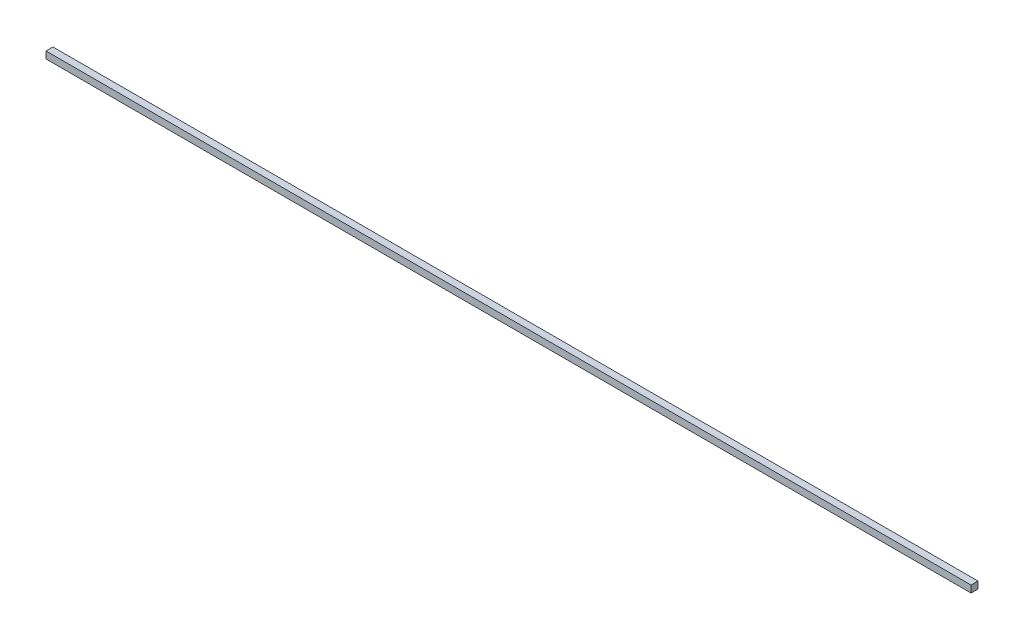
ISO-10303-21;
HEADER;
FILE_DESCRIPTION(('STEP AP214'),'2;1');
FILE_NAME('part.step','',(''),(''),'','','');
FILE_SCHEMA(('AUTOMOTIVE_DESIGN { 1 0 10303 214 1 1 1 1 }'));
ENDSEC;
DATA;
#1=APPLICATION_CONTEXT('core data for automotive mechanical design processes');
#2=APPLICATION_PROTOCOL_DEFINITION('international standard','automotive_design',2000,#1);
#3=PRODUCT_CONTEXT('',#1,'mechanical');
#4=PRODUCT('Part','Part','',(#3));
#5=PRODUCT_RELATED_PRODUCT_CATEGORY('part','',(#4));
#6=PRODUCT_DEFINITION_FORMATION('','',#4);
#7=PRODUCT_DEFINITION_CONTEXT('part definition',#1,'design');
#8=PRODUCT_DEFINITION('design','',#6,#7);
#9=PRODUCT_DEFINITION_SHAPE('','',#8);
#10=(LENGTH_UNIT() NAMED_UNIT(*) SI_UNIT(.MILLI.,.METRE.));
#11=(NAMED_UNIT(*) PLANE_ANGLE_UNIT() SI_UNIT($,.RADIAN.));
#12=(NAMED_UNIT(*) SI_UNIT($,.STERADIAN.) SOLID_ANGLE_UNIT());
#13=UNCERTAINTY_MEASURE_WITH_UNIT(LENGTH_MEASURE(1.E-05),#10,'distance_accuracy_value','');
#14=(GEOMETRIC_REPRESENTATION_CONTEXT(3) GLOBAL_UNCERTAINTY_ASSIGNED_CONTEXT((#13)) GLOBAL_UNIT_ASSIGNED_CONTEXT((#10,
#11,#12)) REPRESENTATION_CONTEXT('',''));
#15=CARTESIAN_POINT('',(0.,0.,0.));
#16=DIRECTION('',(0.,0.,1.));
#17=DIRECTION('',(1.,0.,0.));
#18=AXIS2_PLACEMENT_3D('',#15,#16,#17);
#19=CARTESIAN_POINT('',(656.253394748736,30.8976124589842,5.));
#20=DIRECTION('',(1.,0.,0.));
#21=DIRECTION('',(0.,0.,-1.));
#22=AXIS2_PLACEMENT_3D('',#19,#20,#21);
#23=PLANE('',#22);
#24=DIRECTION('',(0.,-1.,0.));
#25=VECTOR('',#24,1.);
#26=CARTESIAN_POINT('',(656.253394748736,30.8976124589842,0.));
#27=LINE('',#26,#25);
#28=CARTESIAN_POINT('',(656.253394748736,35.8976124589842,0.));
#29=VERTEX_POINT('',#28);
#30=CARTESIAN_POINT('',(656.253394748736,30.8976124589842,0.));
#31=VERTEX_POINT('',#30);
#32=EDGE_CURVE('E96',#29,#31,#27,.T.);
#33=ORIENTED_EDGE('',*,*,#32,.T.);
#34=DIRECTION('',(0.,0.,-1.));
#35=VECTOR('',#34,1.);
#36=CARTESIAN_POINT('',(656.253394748736,30.8976124589842,5.));
#37=LINE('',#36,#35);
#38=CARTESIAN_POINT('',(656.253394748736,30.8976124589842,5.));
#39=VERTEX_POINT('',#38);
#40=EDGE_CURVE('E11',#39,#31,#37,.T.);
#41=ORIENTED_EDGE('',*,*,#40,.F.);
#42=DIRECTION('',(0.,-1.,0.));
#43=VECTOR('',#42,1.);
#44=CARTESIAN_POINT('',(656.253394748736,30.8976124589842,5.));
#45=LINE('',#44,#43);
#46=CARTESIAN_POINT('',(656.253394748736,35.8976124589842,5.));
#47=VERTEX_POINT('',#46);
#48=EDGE_CURVE('E84',#47,#39,#45,.T.);
#49=ORIENTED_EDGE('',*,*,#48,.F.);
#50=DIRECTION('',(0.,0.,-1.));
#51=VECTOR('',#50,1.);
#52=CARTESIAN_POINT('',(656.253394748736,35.8976124589842,5.));
#53=LINE('',#52,#51);
#54=EDGE_CURVE('E92',#47,#29,#53,.T.);
#55=ORIENTED_EDGE('',*,*,#54,.T.);
#56=EDGE_LOOP('',(#33,#41,#49,#55));
#57=FACE_BOUND('',#56,.T.);
#58=ADVANCED_FACE('F33',(#57),#23,.F.);
#59=CARTESIAN_POINT('',(656.253394748736,30.8976124589842,5.));
#60=DIRECTION('',(0.,1.,0.));
#61=DIRECTION('',(0.,0.,1.));
#62=AXIS2_PLACEMENT_3D('',#59,#60,#61);
#63=PLANE('',#62);
#64=DIRECTION('',(1.,0.,0.));
#65=VECTOR('',#64,1.);
#66=CARTESIAN_POINT('',(656.253394748736,30.8976124589842,0.));
#67=LINE('',#66,#65);
#68=CARTESIAN_POINT('',(1321.90265312103,30.8976124589842,0.));
#69=VERTEX_POINT('',#68);
#70=EDGE_CURVE('E88',#31,#69,#67,.T.);
#71=ORIENTED_EDGE('',*,*,#70,.T.);
#72=DIRECTION('',(0.,0.,-1.));
#73=VECTOR('',#72,1.);
#74=CARTESIAN_POINT('',(1321.90265312103,30.8976124589842,5.));
#75=LINE('',#74,#73);
#76=CARTESIAN_POINT('',(1321.90265312103,30.8976124589842,5.));
#77=VERTEX_POINT('',#76);
#78=EDGE_CURVE('E41',#77,#69,#75,.T.);
#79=ORIENTED_EDGE('',*,*,#78,.F.);
#80=DIRECTION('',(1.,0.,0.));
#81=VECTOR('',#80,1.);
#82=CARTESIAN_POINT('',(656.253394748736,30.8976124589842,5.));
#83=LINE('',#82,#81);
#84=EDGE_CURVE('E79',#39,#77,#83,.T.);
#85=ORIENTED_EDGE('',*,*,#84,.F.);
#86=ORIENTED_EDGE('',*,*,#40,.T.);
#87=EDGE_LOOP('',(#71,#79,#85,#86));
#88=FACE_BOUND('',#87,.T.);
#89=ADVANCED_FACE('F87',(#88),#63,.F.);
#90=CARTESIAN_POINT('',(1321.90265312103,30.8976124589842,5.));
#91=DIRECTION('',(-1.,0.,0.));
#92=DIRECTION('',(0.,0.,1.));
#93=AXIS2_PLACEMENT_3D('',#90,#91,#92);
#94=PLANE('',#93);
#95=DIRECTION('',(0.,1.,0.));
#96=VECTOR('',#95,1.);
#97=CARTESIAN_POINT('',(1321.90265312103,30.8976124589842,0.));
#98=LINE('',#97,#96);
#99=CARTESIAN_POINT('',(1321.90265312103,35.8976124589842,0.));
#100=VERTEX_POINT('',#99);
#101=EDGE_CURVE('E66',#69,#100,#98,.T.);
#102=ORIENTED_EDGE('',*,*,#101,.T.);
#103=DIRECTION('',(0.,0.,-1.));
#104=VECTOR('',#103,1.);
#105=CARTESIAN_POINT('',(1321.90265312103,35.8976124589842,5.));
#106=LINE('',#105,#104);
#107=CARTESIAN_POINT('',(1321.90265312103,35.8976124589842,5.));
#108=VERTEX_POINT('',#107);
#109=EDGE_CURVE('E89',#108,#100,#106,.T.);
#110=ORIENTED_EDGE('',*,*,#109,.F.);
#111=DIRECTION('',(0.,1.,0.));
#112=VECTOR('',#111,1.);
#113=CARTESIAN_POINT('',(1321.90265312103,30.8976124589842,5.));
#114=LINE('',#113,#112);
#115=EDGE_CURVE('E82',#77,#108,#114,.T.);
#116=ORIENTED_EDGE('',*,*,#115,.F.);
#117=ORIENTED_EDGE('',*,*,#78,.T.);
#118=EDGE_LOOP('',(#102,#110,#116,#117));
#119=FACE_BOUND('',#118,.T.);
#120=ADVANCED_FACE('F90',(#119),#94,.F.);
#121=CARTESIAN_POINT('',(656.253394748736,35.8976124589842,5.));
#122=DIRECTION('',(0.,-1.,0.));
#123=DIRECTION('',(0.,0.,-1.));
#124=AXIS2_PLACEMENT_3D('',#121,#122,#123);
#125=PLANE('',#124);
#126=DIRECTION('',(-1.,0.,0.));
#127=VECTOR('',#126,1.);
#128=CARTESIAN_POINT('',(656.253394748736,35.8976124589842,0.));
#129=LINE('',#128,#127);
#130=EDGE_CURVE('E72',#100,#29,#129,.T.);
#131=ORIENTED_EDGE('',*,*,#130,.T.);
#132=ORIENTED_EDGE('',*,*,#54,.F.);
#133=DIRECTION('',(-1.,0.,0.));
#134=VECTOR('',#133,1.);
#135=CARTESIAN_POINT('',(656.253394748736,35.8976124589842,5.));
#136=LINE('',#135,#134);
#137=EDGE_CURVE('E49',#108,#47,#136,.T.);
#138=ORIENTED_EDGE('',*,*,#137,.F.);
#139=ORIENTED_EDGE('',*,*,#109,.T.);
#140=EDGE_LOOP('',(#131,#132,#138,#139));
#141=FACE_BOUND('',#140,.T.);
#142=ADVANCED_FACE('F103',(#141),#125,.F.);
#143=CARTESIAN_POINT('',(0.,0.,5.));
#144=DIRECTION('',(0.,0.,-1.));
#145=DIRECTION('',(-1.,0.,0.));
#146=AXIS2_PLACEMENT_3D('',#143,#144,#145);
#147=PLANE('',#146);
#148=ORIENTED_EDGE('',*,*,#48,.T.);
#149=ORIENTED_EDGE('',*,*,#84,.T.);
#150=ORIENTED_EDGE('',*,*,#115,.T.);
#151=ORIENTED_EDGE('',*,*,#137,.T.);
#152=EDGE_LOOP('',(#148,#149,#150,#151));
#153=FACE_BOUND('',#152,.T.);
#154=ADVANCED_FACE('F80',(#153),#147,.F.);
#155=CARTESIAN_POINT('',(0.,0.,0.));
#156=DIRECTION('',(0.,0.,-1.));
#157=DIRECTION('',(-1.,0.,0.));
#158=AXIS2_PLACEMENT_3D('',#155,#156,#157);
#159=PLANE('',#158);
#160=ORIENTED_EDGE('',*,*,#32,.F.);
#161=ORIENTED_EDGE('',*,*,#130,.F.);
#162=ORIENTED_EDGE('',*,*,#101,.F.);
#163=ORIENTED_EDGE('',*,*,#70,.F.);
#164=EDGE_LOOP('',(#160,#161,#162,#163));
#165=FACE_BOUND('',#164,.T.);
#166=ADVANCED_FACE('F106',(#165),#159,.T.);
#167=CLOSED_SHELL('',(#58,#89,#120,#142,#154,#166));
#168=MANIFOLD_SOLID_BREP('B2',#167);
#169=ADVANCED_BREP_SHAPE_REPRESENTATION('',(#18,#168),#14);
#170=SHAPE_DEFINITION_REPRESENTATION(#9,#169);
ENDSEC;
END-ISO-10303-21;
